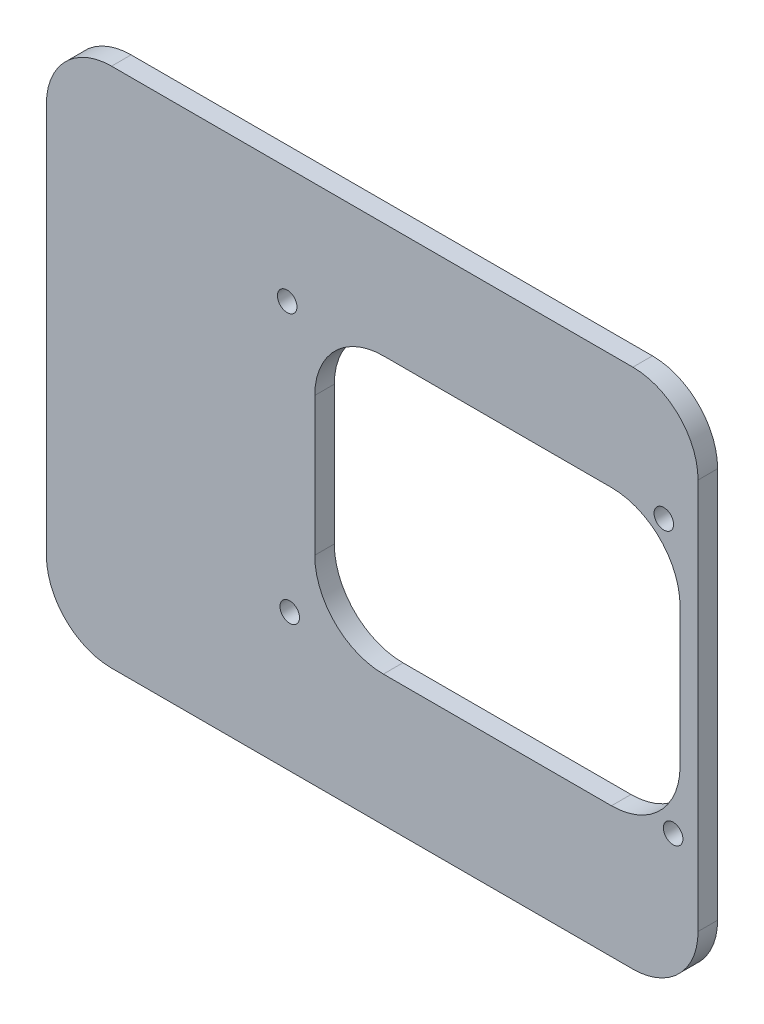
ISO-10303-21;
HEADER;
FILE_DESCRIPTION(('STEP AP214'),'2;1');
FILE_NAME('part.step','',(''),(''),'','','');
FILE_SCHEMA(('AUTOMOTIVE_DESIGN { 1 0 10303 214 1 1 1 1 }'));
ENDSEC;
DATA;
#1=APPLICATION_CONTEXT('core data for automotive mechanical design processes');
#2=APPLICATION_PROTOCOL_DEFINITION('international standard','automotive_design',2000,#1);
#3=PRODUCT_CONTEXT('',#1,'mechanical');
#4=PRODUCT('Part','Part','',(#3));
#5=PRODUCT_RELATED_PRODUCT_CATEGORY('part','',(#4));
#6=PRODUCT_DEFINITION_FORMATION('','',#4);
#7=PRODUCT_DEFINITION_CONTEXT('part definition',#1,'design');
#8=PRODUCT_DEFINITION('design','',#6,#7);
#9=PRODUCT_DEFINITION_SHAPE('','',#8);
#10=(LENGTH_UNIT() NAMED_UNIT(*) SI_UNIT(.MILLI.,.METRE.));
#11=(NAMED_UNIT(*) PLANE_ANGLE_UNIT() SI_UNIT($,.RADIAN.));
#12=(NAMED_UNIT(*) SI_UNIT($,.STERADIAN.) SOLID_ANGLE_UNIT());
#13=UNCERTAINTY_MEASURE_WITH_UNIT(LENGTH_MEASURE(1.E-05),#10,'distance_accuracy_value','');
#14=(GEOMETRIC_REPRESENTATION_CONTEXT(3) GLOBAL_UNCERTAINTY_ASSIGNED_CONTEXT((#13)) GLOBAL_UNIT_ASSIGNED_CONTEXT((#10,
#11,#12)) REPRESENTATION_CONTEXT('',''));
#15=CARTESIAN_POINT('',(0.,0.,0.));
#16=DIRECTION('',(0.,0.,1.));
#17=DIRECTION('',(1.,0.,0.));
#18=AXIS2_PLACEMENT_3D('',#15,#16,#17);
#19=CARTESIAN_POINT('',(7.122051999723,-1.872741623103,3.));
#20=DIRECTION('',(0.,0.,1.));
#21=DIRECTION('',(1.,0.,0.));
#22=AXIS2_PLACEMENT_3D('',#19,#20,#21);
#23=PLANE('',#22);
#24=CARTESIAN_POINT('',(-13.046573,19.865738,3.));
#25=DIRECTION('',(0.,0.,1.));
#26=DIRECTION('',(1.,0.,0.));
#27=AXIS2_PLACEMENT_3D('',#24,#25,#26);
#28=CIRCLE('',#27,1.5);
#29=CARTESIAN_POINT('',(-11.546573,19.865738,3.));
#30=VERTEX_POINT('',#29);
#31=EDGE_CURVE('E24',#30,#30,#28,.T.);
#32=ORIENTED_EDGE('',*,*,#31,.F.);
#33=EDGE_LOOP('',(#32));
#34=FACE_BOUND('',#33,.T.);
#35=CARTESIAN_POINT('',(44.745636,19.865738,3.));
#36=DIRECTION('',(0.,0.,1.));
#37=DIRECTION('',(1.,0.,0.));
#38=AXIS2_PLACEMENT_3D('',#35,#36,#37);
#39=CIRCLE('',#38,1.5);
#40=CARTESIAN_POINT('',(46.245636,19.865738,3.));
#41=VERTEX_POINT('',#40);
#42=EDGE_CURVE('E265',#41,#41,#39,.T.);
#43=ORIENTED_EDGE('',*,*,#42,.F.);
#44=EDGE_LOOP('',(#43));
#45=FACE_BOUND('',#44,.T.);
#46=CARTESIAN_POINT('',(-12.656964,-21.23714197154,3.));
#47=DIRECTION('',(0.,0.,1.));
#48=DIRECTION('',(1.,0.,0.));
#49=AXIS2_PLACEMENT_3D('',#46,#47,#48);
#50=CIRCLE('',#49,1.5);
#51=CARTESIAN_POINT('',(-11.156964,-21.23714197154,3.));
#52=VERTEX_POINT('',#51);
#53=EDGE_CURVE('E151',#52,#52,#50,.T.);
#54=ORIENTED_EDGE('',*,*,#53,.F.);
#55=EDGE_LOOP('',(#54));
#56=FACE_BOUND('',#55,.T.);
#57=CARTESIAN_POINT('',(46.174213,-21.23714197154,3.));
#58=DIRECTION('',(0.,0.,1.));
#59=DIRECTION('',(1.,0.,0.));
#60=AXIS2_PLACEMENT_3D('',#57,#58,#59);
#61=CIRCLE('',#60,1.5);
#62=CARTESIAN_POINT('',(47.674213,-21.23714197154,3.));
#63=VERTEX_POINT('',#62);
#64=EDGE_CURVE('E302',#63,#63,#61,.T.);
#65=ORIENTED_EDGE('',*,*,#64,.F.);
#66=EDGE_LOOP('',(#65));
#67=FACE_BOUND('',#66,.T.);
#68=DIRECTION('',(1.,0.,0.));
#69=VECTOR('',#68,1.);
#70=CARTESIAN_POINT('',(1.711141866892,20.,3.));
#71=LINE('',#70,#69);
#72=CARTESIAN_POINT('',(1.711141866892,20.,3.));
#73=VERTEX_POINT('',#72);
#74=CARTESIAN_POINT('',(36.711141866892,20.,3.));
#75=VERTEX_POINT('',#74);
#76=EDGE_CURVE('E361',#73,#75,#71,.T.);
#77=ORIENTED_EDGE('',*,*,#76,.T.);
#78=CARTESIAN_POINT('',(36.711141866892,9.471174926658,3.));
#79=DIRECTION('',(0.,0.,1.));
#80=DIRECTION('',(1.,0.,0.));
#81=AXIS2_PLACEMENT_3D('',#78,#79,#80);
#82=CIRCLE('',#81,10.528825073342);
#83=CARTESIAN_POINT('',(47.239966940235,9.471174926658,3.));
#84=VERTEX_POINT('',#83);
#85=EDGE_CURVE('E253',#84,#75,#82,.T.);
#86=ORIENTED_EDGE('',*,*,#85,.F.);
#87=DIRECTION('',(0.,-1.,0.));
#88=VECTOR('',#87,1.);
#89=CARTESIAN_POINT('',(47.239966940235,9.471174926658,3.));
#90=LINE('',#89,#88);
#91=CARTESIAN_POINT('',(47.239966940235,-11.76385872061,3.));
#92=VERTEX_POINT('',#91);
#93=EDGE_CURVE('E277',#84,#92,#90,.T.);
#94=ORIENTED_EDGE('',*,*,#93,.T.);
#95=CARTESIAN_POINT('',(36.711141866892,-11.76385872061,3.));
#96=DIRECTION('',(0.,0.,1.));
#97=DIRECTION('',(1.,0.,0.));
#98=AXIS2_PLACEMENT_3D('',#95,#96,#97);
#99=CIRCLE('',#98,10.528825073342);
#100=CARTESIAN_POINT('',(36.711141866892,-22.29268379395,3.));
#101=VERTEX_POINT('',#100);
#102=EDGE_CURVE('E248',#101,#92,#99,.T.);
#103=ORIENTED_EDGE('',*,*,#102,.F.);
#104=DIRECTION('',(-1.,0.,0.));
#105=VECTOR('',#104,1.);
#106=CARTESIAN_POINT('',(36.711141866892,-22.29268379395,3.));
#107=LINE('',#106,#105);
#108=CARTESIAN_POINT('',(1.711141866892,-22.29268379395,3.));
#109=VERTEX_POINT('',#108);
#110=EDGE_CURVE('E17',#101,#109,#107,.T.);
#111=ORIENTED_EDGE('',*,*,#110,.T.);
#112=CARTESIAN_POINT('',(1.711141866892,-11.76385872061,3.));
#113=DIRECTION('',(0.,0.,1.));
#114=DIRECTION('',(1.,0.,0.));
#115=AXIS2_PLACEMENT_3D('',#112,#113,#114);
#116=CIRCLE('',#115,10.528825073342);
#117=CARTESIAN_POINT('',(-8.81768320645,-11.76385872061,3.));
#118=VERTEX_POINT('',#117);
#119=EDGE_CURVE('E399',#118,#109,#116,.T.);
#120=ORIENTED_EDGE('',*,*,#119,.F.);
#121=DIRECTION('',(0.,1.,0.));
#122=VECTOR('',#121,1.);
#123=CARTESIAN_POINT('',(-8.81768320645,-11.76385872061,3.));
#124=LINE('',#123,#122);
#125=CARTESIAN_POINT('',(-8.81768320645,9.471174926658,3.));
#126=VERTEX_POINT('',#125);
#127=EDGE_CURVE('E218',#118,#126,#124,.T.);
#128=ORIENTED_EDGE('',*,*,#127,.T.);
#129=CARTESIAN_POINT('',(1.711141866892,9.471174926658,3.));
#130=DIRECTION('',(0.,0.,1.));
#131=DIRECTION('',(1.,0.,0.));
#132=AXIS2_PLACEMENT_3D('',#129,#130,#131);
#133=CIRCLE('',#132,10.528825073342);
#134=EDGE_CURVE('E230',#73,#126,#133,.T.);
#135=ORIENTED_EDGE('',*,*,#134,.F.);
#136=EDGE_LOOP('',(#77,#86,#94,#103,#111,#120,#128,#135));
#137=FACE_BOUND('',#136,.T.);
#138=CARTESIAN_POINT('',(-40.,27.641417965894,3.));
#139=DIRECTION('',(0.,0.,1.));
#140=DIRECTION('',(1.,0.,0.));
#141=AXIS2_PLACEMENT_3D('',#138,#139,#140);
#142=CIRCLE('',#141,9.999999999999);
#143=CARTESIAN_POINT('',(-40.,37.641417965894,3.));
#144=VERTEX_POINT('',#143);
#145=CARTESIAN_POINT('',(-50.,27.641417965894,3.));
#146=VERTEX_POINT('',#145);
#147=EDGE_CURVE('E259',#144,#146,#142,.T.);
#148=ORIENTED_EDGE('',*,*,#147,.T.);
#149=DIRECTION('',(0.,1.,0.));
#150=VECTOR('',#149,1.);
#151=CARTESIAN_POINT('',(-50.,-32.3585820341,3.));
#152=LINE('',#151,#150);
#153=CARTESIAN_POINT('',(-50.,-32.3585820341,3.));
#154=VERTEX_POINT('',#153);
#155=EDGE_CURVE('E351',#154,#146,#152,.T.);
#156=ORIENTED_EDGE('',*,*,#155,.F.);
#157=CARTESIAN_POINT('',(-40.,-32.3585820341,3.));
#158=DIRECTION('',(0.,0.,1.));
#159=DIRECTION('',(1.,0.,0.));
#160=AXIS2_PLACEMENT_3D('',#157,#158,#159);
#161=CIRCLE('',#160,9.999999999999);
#162=CARTESIAN_POINT('',(-40.,-42.3585820341,3.));
#163=VERTEX_POINT('',#162);
#164=EDGE_CURVE('E340',#154,#163,#161,.T.);
#165=ORIENTED_EDGE('',*,*,#164,.T.);
#166=DIRECTION('',(-1.,0.,0.));
#167=VECTOR('',#166,1.);
#168=CARTESIAN_POINT('',(40.,-42.3585820341,3.));
#169=LINE('',#168,#167);
#170=CARTESIAN_POINT('',(40.,-42.3585820341,3.));
#171=VERTEX_POINT('',#170);
#172=EDGE_CURVE('E373',#171,#163,#169,.T.);
#173=ORIENTED_EDGE('',*,*,#172,.F.);
#174=CARTESIAN_POINT('',(40.,-32.3585820341,3.));
#175=DIRECTION('',(0.,0.,1.));
#176=DIRECTION('',(1.,0.,0.));
#177=AXIS2_PLACEMENT_3D('',#174,#175,#176);
#178=CIRCLE('',#177,9.999999999999);
#179=CARTESIAN_POINT('',(49.999999999999,-32.3585820341,3.));
#180=VERTEX_POINT('',#179);
#181=EDGE_CURVE('E290',#171,#180,#178,.T.);
#182=ORIENTED_EDGE('',*,*,#181,.T.);
#183=DIRECTION('',(0.,-1.,0.));
#184=VECTOR('',#183,1.);
#185=CARTESIAN_POINT('',(49.999999999999,27.641417965895,3.));
#186=LINE('',#185,#184);
#187=CARTESIAN_POINT('',(49.999999999999,27.641417965895,3.));
#188=VERTEX_POINT('',#187);
#189=EDGE_CURVE('E289',#188,#180,#186,.T.);
#190=ORIENTED_EDGE('',*,*,#189,.F.);
#191=CARTESIAN_POINT('',(40.,27.641417965895,3.));
#192=DIRECTION('',(0.,0.,1.));
#193=DIRECTION('',(1.,0.,0.));
#194=AXIS2_PLACEMENT_3D('',#191,#192,#193);
#195=CIRCLE('',#194,9.999999999999);
#196=CARTESIAN_POINT('',(40.,37.641417965894,3.));
#197=VERTEX_POINT('',#196);
#198=EDGE_CURVE('E307',#188,#197,#195,.T.);
#199=ORIENTED_EDGE('',*,*,#198,.T.);
#200=DIRECTION('',(1.,0.,0.));
#201=VECTOR('',#200,1.);
#202=CARTESIAN_POINT('',(-40.,37.641417965894,3.));
#203=LINE('',#202,#201);
#204=EDGE_CURVE('E243',#144,#197,#203,.T.);
#205=ORIENTED_EDGE('',*,*,#204,.F.);
#206=EDGE_LOOP('',(#148,#156,#165,#173,#182,#190,#199,#205));
#207=FACE_BOUND('',#206,.T.);
#208=ADVANCED_FACE('F14',(#34,#45,#56,#67,#137,#207),#23,.T.);
#209=CARTESIAN_POINT('',(7.122051999723,-1.872741623103,0.));
#210=DIRECTION('',(0.,0.,1.));
#211=DIRECTION('',(1.,0.,0.));
#212=AXIS2_PLACEMENT_3D('',#209,#210,#211);
#213=PLANE('',#212);
#214=CARTESIAN_POINT('',(-13.046573,19.865738,0.));
#215=DIRECTION('',(0.,0.,1.));
#216=DIRECTION('',(1.,0.,0.));
#217=AXIS2_PLACEMENT_3D('',#214,#215,#216);
#218=CIRCLE('',#217,1.5);
#219=CARTESIAN_POINT('',(-11.546573,19.865738,0.));
#220=VERTEX_POINT('',#219);
#221=EDGE_CURVE('E9',#220,#220,#218,.T.);
#222=ORIENTED_EDGE('',*,*,#221,.T.);
#223=EDGE_LOOP('',(#222));
#224=FACE_BOUND('',#223,.T.);
#225=CARTESIAN_POINT('',(44.745636,19.865738,0.));
#226=DIRECTION('',(0.,0.,1.));
#227=DIRECTION('',(1.,0.,0.));
#228=AXIS2_PLACEMENT_3D('',#225,#226,#227);
#229=CIRCLE('',#228,1.5);
#230=CARTESIAN_POINT('',(46.245636,19.865738,0.));
#231=VERTEX_POINT('',#230);
#232=EDGE_CURVE('E160',#231,#231,#229,.T.);
#233=ORIENTED_EDGE('',*,*,#232,.T.);
#234=EDGE_LOOP('',(#233));
#235=FACE_BOUND('',#234,.T.);
#236=CARTESIAN_POINT('',(-12.656964,-21.23714197154,0.));
#237=DIRECTION('',(0.,0.,1.));
#238=DIRECTION('',(1.,0.,0.));
#239=AXIS2_PLACEMENT_3D('',#236,#237,#238);
#240=CIRCLE('',#239,1.5);
#241=CARTESIAN_POINT('',(-11.156964,-21.23714197154,0.));
#242=VERTEX_POINT('',#241);
#243=EDGE_CURVE('E142',#242,#242,#240,.T.);
#244=ORIENTED_EDGE('',*,*,#243,.T.);
#245=EDGE_LOOP('',(#244));
#246=FACE_BOUND('',#245,.T.);
#247=CARTESIAN_POINT('',(46.174213,-21.23714197154,0.));
#248=DIRECTION('',(0.,0.,1.));
#249=DIRECTION('',(1.,0.,0.));
#250=AXIS2_PLACEMENT_3D('',#247,#248,#249);
#251=CIRCLE('',#250,1.5);
#252=CARTESIAN_POINT('',(47.674213,-21.23714197154,0.));
#253=VERTEX_POINT('',#252);
#254=EDGE_CURVE('E119',#253,#253,#251,.T.);
#255=ORIENTED_EDGE('',*,*,#254,.T.);
#256=EDGE_LOOP('',(#255));
#257=FACE_BOUND('',#256,.T.);
#258=CARTESIAN_POINT('',(1.711141866892,9.471174926658,0.));
#259=DIRECTION('',(0.,0.,1.));
#260=DIRECTION('',(1.,0.,0.));
#261=AXIS2_PLACEMENT_3D('',#258,#259,#260);
#262=CIRCLE('',#261,10.528825073342);
#263=CARTESIAN_POINT('',(1.711141866892,20.,0.));
#264=VERTEX_POINT('',#263);
#265=CARTESIAN_POINT('',(-8.81768320645,9.471174926658,0.));
#266=VERTEX_POINT('',#265);
#267=EDGE_CURVE('E219',#264,#266,#262,.T.);
#268=ORIENTED_EDGE('',*,*,#267,.T.);
#269=DIRECTION('',(0.,1.,0.));
#270=VECTOR('',#269,1.);
#271=CARTESIAN_POINT('',(-8.81768320645,-11.76385872061,0.));
#272=LINE('',#271,#270);
#273=CARTESIAN_POINT('',(-8.81768320645,-11.76385872061,0.));
#274=VERTEX_POINT('',#273);
#275=EDGE_CURVE('E206',#274,#266,#272,.T.);
#276=ORIENTED_EDGE('',*,*,#275,.F.);
#277=CARTESIAN_POINT('',(1.711141866892,-11.76385872061,0.));
#278=DIRECTION('',(0.,0.,1.));
#279=DIRECTION('',(1.,0.,0.));
#280=AXIS2_PLACEMENT_3D('',#277,#278,#279);
#281=CIRCLE('',#280,10.528825073342);
#282=CARTESIAN_POINT('',(1.711141866892,-22.29268379395,0.));
#283=VERTEX_POINT('',#282);
#284=EDGE_CURVE('E298',#274,#283,#281,.T.);
#285=ORIENTED_EDGE('',*,*,#284,.T.);
#286=DIRECTION('',(-1.,0.,0.));
#287=VECTOR('',#286,1.);
#288=CARTESIAN_POINT('',(36.711141866892,-22.29268379395,0.));
#289=LINE('',#288,#287);
#290=CARTESIAN_POINT('',(36.711141866892,-22.29268379395,0.));
#291=VERTEX_POINT('',#290);
#292=EDGE_CURVE('E295',#291,#283,#289,.T.);
#293=ORIENTED_EDGE('',*,*,#292,.F.);
#294=CARTESIAN_POINT('',(36.711141866892,-11.76385872061,0.));
#295=DIRECTION('',(0.,0.,1.));
#296=DIRECTION('',(1.,0.,0.));
#297=AXIS2_PLACEMENT_3D('',#294,#295,#296);
#298=CIRCLE('',#297,10.528825073342);
#299=CARTESIAN_POINT('',(47.239966940235,-11.76385872061,0.));
#300=VERTEX_POINT('',#299);
#301=EDGE_CURVE('E278',#291,#300,#298,.T.);
#302=ORIENTED_EDGE('',*,*,#301,.T.);
#303=DIRECTION('',(0.,-1.,0.));
#304=VECTOR('',#303,1.);
#305=CARTESIAN_POINT('',(47.239966940235,9.471174926658,0.));
#306=LINE('',#305,#304);
#307=CARTESIAN_POINT('',(47.239966940235,9.471174926658,0.));
#308=VERTEX_POINT('',#307);
#309=EDGE_CURVE('E274',#308,#300,#306,.T.);
#310=ORIENTED_EDGE('',*,*,#309,.F.);
#311=CARTESIAN_POINT('',(36.711141866892,9.471174926658,0.));
#312=DIRECTION('',(0.,0.,1.));
#313=DIRECTION('',(1.,0.,0.));
#314=AXIS2_PLACEMENT_3D('',#311,#312,#313);
#315=CIRCLE('',#314,10.528825073342);
#316=CARTESIAN_POINT('',(36.711141866892,20.,0.));
#317=VERTEX_POINT('',#316);
#318=EDGE_CURVE('E252',#308,#317,#315,.T.);
#319=ORIENTED_EDGE('',*,*,#318,.T.);
#320=DIRECTION('',(1.,0.,0.));
#321=VECTOR('',#320,1.);
#322=CARTESIAN_POINT('',(1.711141866892,20.,0.));
#323=LINE('',#322,#321);
#324=EDGE_CURVE('E133',#264,#317,#323,.T.);
#325=ORIENTED_EDGE('',*,*,#324,.F.);
#326=EDGE_LOOP('',(#268,#276,#285,#293,#302,#310,#319,#325));
#327=FACE_BOUND('',#326,.T.);
#328=DIRECTION('',(1.,0.,0.));
#329=VECTOR('',#328,1.);
#330=CARTESIAN_POINT('',(-40.,37.641417965894,0.));
#331=LINE('',#330,#329);
#332=CARTESIAN_POINT('',(-40.,37.641417965894,0.));
#333=VERTEX_POINT('',#332);
#334=CARTESIAN_POINT('',(40.,37.641417965894,0.));
#335=VERTEX_POINT('',#334);
#336=EDGE_CURVE('E240',#333,#335,#331,.T.);
#337=ORIENTED_EDGE('',*,*,#336,.T.);
#338=CARTESIAN_POINT('',(40.,27.641417965895,0.));
#339=DIRECTION('',(0.,0.,1.));
#340=DIRECTION('',(1.,0.,0.));
#341=AXIS2_PLACEMENT_3D('',#338,#339,#340);
#342=CIRCLE('',#341,9.999999999999);
#343=CARTESIAN_POINT('',(49.999999999999,27.641417965895,0.));
#344=VERTEX_POINT('',#343);
#345=EDGE_CURVE('E308',#344,#335,#342,.T.);
#346=ORIENTED_EDGE('',*,*,#345,.F.);
#347=DIRECTION('',(0.,-1.,0.));
#348=VECTOR('',#347,1.);
#349=CARTESIAN_POINT('',(49.999999999999,27.641417965895,0.));
#350=LINE('',#349,#348);
#351=CARTESIAN_POINT('',(49.999999999999,-32.3585820341,0.));
#352=VERTEX_POINT('',#351);
#353=EDGE_CURVE('E332',#344,#352,#350,.T.);
#354=ORIENTED_EDGE('',*,*,#353,.T.);
#355=CARTESIAN_POINT('',(40.,-32.3585820341,0.));
#356=DIRECTION('',(0.,0.,1.));
#357=DIRECTION('',(1.,0.,0.));
#358=AXIS2_PLACEMENT_3D('',#355,#356,#357);
#359=CIRCLE('',#358,9.999999999999);
#360=CARTESIAN_POINT('',(40.,-42.3585820341,0.));
#361=VERTEX_POINT('',#360);
#362=EDGE_CURVE('E268',#361,#352,#359,.T.);
#363=ORIENTED_EDGE('',*,*,#362,.F.);
#364=DIRECTION('',(-1.,0.,0.));
#365=VECTOR('',#364,1.);
#366=CARTESIAN_POINT('',(40.,-42.3585820341,0.));
#367=LINE('',#366,#365);
#368=CARTESIAN_POINT('',(-40.,-42.3585820341,0.));
#369=VERTEX_POINT('',#368);
#370=EDGE_CURVE('E273',#361,#369,#367,.T.);
#371=ORIENTED_EDGE('',*,*,#370,.T.);
#372=CARTESIAN_POINT('',(-40.,-32.3585820341,0.));
#373=DIRECTION('',(0.,0.,1.));
#374=DIRECTION('',(1.,0.,0.));
#375=AXIS2_PLACEMENT_3D('',#372,#373,#374);
#376=CIRCLE('',#375,9.999999999999);
#377=CARTESIAN_POINT('',(-50.,-32.3585820341,0.));
#378=VERTEX_POINT('',#377);
#379=EDGE_CURVE('E279',#378,#369,#376,.T.);
#380=ORIENTED_EDGE('',*,*,#379,.F.);
#381=DIRECTION('',(0.,1.,0.));
#382=VECTOR('',#381,1.);
#383=CARTESIAN_POINT('',(-50.,-32.3585820341,0.));
#384=LINE('',#383,#382);
#385=CARTESIAN_POINT('',(-50.,27.641417965894,0.));
#386=VERTEX_POINT('',#385);
#387=EDGE_CURVE('E284',#378,#386,#384,.T.);
#388=ORIENTED_EDGE('',*,*,#387,.T.);
#389=CARTESIAN_POINT('',(-40.,27.641417965894,0.));
#390=DIRECTION('',(0.,0.,1.));
#391=DIRECTION('',(1.,0.,0.));
#392=AXIS2_PLACEMENT_3D('',#389,#390,#391);
#393=CIRCLE('',#392,9.999999999999);
#394=EDGE_CURVE('E335',#333,#386,#393,.T.);
#395=ORIENTED_EDGE('',*,*,#394,.F.);
#396=EDGE_LOOP('',(#337,#346,#354,#363,#371,#380,#388,#395));
#397=FACE_BOUND('',#396,.T.);
#398=ADVANCED_FACE('F222',(#224,#235,#246,#257,#327,#397),#213,.F.);
#399=CARTESIAN_POINT('',(-13.046573,19.865738,0.));
#400=DIRECTION('',(0.,0.,-1.));
#401=DIRECTION('',(1.,0.,0.));
#402=AXIS2_PLACEMENT_3D('',#399,#400,#401);
#403=CYLINDRICAL_SURFACE('',#402,1.5);
#404=DIRECTION('',(0.,0.,1.));
#405=VECTOR('',#404,1.);
#406=CARTESIAN_POINT('',(-11.546573,19.865738,0.));
#407=LINE('',#406,#405);
#408=EDGE_CURVE('E260',#220,#30,#407,.T.);
#409=ORIENTED_EDGE('',*,*,#408,.T.);
#410=ORIENTED_EDGE('',*,*,#31,.T.);
#411=ORIENTED_EDGE('',*,*,#408,.F.);
#412=ORIENTED_EDGE('',*,*,#221,.F.);
#413=EDGE_LOOP('',(#409,#410,#411,#412));
#414=FACE_BOUND('',#413,.T.);
#415=ADVANCED_FACE('F489',(#414),#403,.F.);
#416=CARTESIAN_POINT('',(44.745636,19.865738,0.));
#417=DIRECTION('',(0.,0.,-1.));
#418=DIRECTION('',(1.,0.,0.));
#419=AXIS2_PLACEMENT_3D('',#416,#417,#418);
#420=CYLINDRICAL_SURFACE('',#419,1.5);
#421=DIRECTION('',(0.,0.,1.));
#422=VECTOR('',#421,1.);
#423=CARTESIAN_POINT('',(46.245636,19.865738,0.));
#424=LINE('',#423,#422);
#425=EDGE_CURVE('E329',#231,#41,#424,.T.);
#426=ORIENTED_EDGE('',*,*,#425,.T.);
#427=ORIENTED_EDGE('',*,*,#42,.T.);
#428=ORIENTED_EDGE('',*,*,#425,.F.);
#429=ORIENTED_EDGE('',*,*,#232,.F.);
#430=EDGE_LOOP('',(#426,#427,#428,#429));
#431=FACE_BOUND('',#430,.T.);
#432=ADVANCED_FACE('F509',(#431),#420,.F.);
#433=CARTESIAN_POINT('',(-12.656964,-21.23714197154,0.));
#434=DIRECTION('',(0.,0.,-1.));
#435=DIRECTION('',(1.,0.,0.));
#436=AXIS2_PLACEMENT_3D('',#433,#434,#435);
#437=CYLINDRICAL_SURFACE('',#436,1.5);
#438=DIRECTION('',(0.,0.,1.));
#439=VECTOR('',#438,1.);
#440=CARTESIAN_POINT('',(-11.156964,-21.23714197154,0.));
#441=LINE('',#440,#439);
#442=EDGE_CURVE('E301',#242,#52,#441,.T.);
#443=ORIENTED_EDGE('',*,*,#442,.T.);
#444=ORIENTED_EDGE('',*,*,#53,.T.);
#445=ORIENTED_EDGE('',*,*,#442,.F.);
#446=ORIENTED_EDGE('',*,*,#243,.F.);
#447=EDGE_LOOP('',(#443,#444,#445,#446));
#448=FACE_BOUND('',#447,.T.);
#449=ADVANCED_FACE('F502',(#448),#437,.F.);
#450=CARTESIAN_POINT('',(46.174213,-21.23714197154,0.));
#451=DIRECTION('',(0.,0.,-1.));
#452=DIRECTION('',(1.,0.,0.));
#453=AXIS2_PLACEMENT_3D('',#450,#451,#452);
#454=CYLINDRICAL_SURFACE('',#453,1.5);
#455=DIRECTION('',(0.,0.,1.));
#456=VECTOR('',#455,1.);
#457=CARTESIAN_POINT('',(47.674213,-21.23714197154,0.));
#458=LINE('',#457,#456);
#459=EDGE_CURVE('E364',#253,#63,#458,.T.);
#460=ORIENTED_EDGE('',*,*,#459,.T.);
#461=ORIENTED_EDGE('',*,*,#64,.T.);
#462=ORIENTED_EDGE('',*,*,#459,.F.);
#463=ORIENTED_EDGE('',*,*,#254,.F.);
#464=EDGE_LOOP('',(#460,#461,#462,#463));
#465=FACE_BOUND('',#464,.T.);
#466=ADVANCED_FACE('F499',(#465),#454,.F.);
#467=CARTESIAN_POINT('',(1.711141866892,20.,0.));
#468=DIRECTION('',(0.,1.,0.));
#469=DIRECTION('',(1.,0.,0.));
#470=AXIS2_PLACEMENT_3D('',#467,#468,#469);
#471=PLANE('',#470);
#472=ORIENTED_EDGE('',*,*,#324,.T.);
#473=DIRECTION('',(0.,0.,1.));
#474=VECTOR('',#473,1.);
#475=CARTESIAN_POINT('',(36.711141866892,20.,0.));
#476=LINE('',#475,#474);
#477=EDGE_CURVE('E249',#317,#75,#476,.T.);
#478=ORIENTED_EDGE('',*,*,#477,.T.);
#479=ORIENTED_EDGE('',*,*,#76,.F.);
#480=DIRECTION('',(0.,0.,1.));
#481=VECTOR('',#480,1.);
#482=CARTESIAN_POINT('',(1.711141866892,20.,0.));
#483=LINE('',#482,#481);
#484=EDGE_CURVE('E237',#264,#73,#483,.T.);
#485=ORIENTED_EDGE('',*,*,#484,.F.);
#486=EDGE_LOOP('',(#472,#478,#479,#485));
#487=FACE_BOUND('',#486,.T.);
#488=ADVANCED_FACE('F501',(#487),#471,.F.);
#489=CARTESIAN_POINT('',(36.711141866892,9.471174926658,0.));
#490=DIRECTION('',(0.,0.,-1.));
#491=DIRECTION('',(1.,0.,0.));
#492=AXIS2_PLACEMENT_3D('',#489,#490,#491);
#493=CYLINDRICAL_SURFACE('',#492,10.528825073342);
#494=DIRECTION('',(0.,0.,1.));
#495=VECTOR('',#494,1.);
#496=CARTESIAN_POINT('',(47.239966940235,9.471174926658,0.));
#497=LINE('',#496,#495);
#498=EDGE_CURVE('E294',#308,#84,#497,.T.);
#499=ORIENTED_EDGE('',*,*,#498,.T.);
#500=ORIENTED_EDGE('',*,*,#85,.T.);
#501=ORIENTED_EDGE('',*,*,#477,.F.);
#502=ORIENTED_EDGE('',*,*,#318,.F.);
#503=EDGE_LOOP('',(#499,#500,#501,#502));
#504=FACE_BOUND('',#503,.T.);
#505=ADVANCED_FACE('F507',(#504),#493,.F.);
#506=CARTESIAN_POINT('',(47.239966940235,9.471174926658,0.));
#507=DIRECTION('',(1.,0.,0.));
#508=DIRECTION('',(0.,1.,0.));
#509=AXIS2_PLACEMENT_3D('',#506,#507,#508);
#510=PLANE('',#509);
#511=ORIENTED_EDGE('',*,*,#309,.T.);
#512=DIRECTION('',(0.,0.,1.));
#513=VECTOR('',#512,1.);
#514=CARTESIAN_POINT('',(47.239966940235,-11.76385872061,0.));
#515=LINE('',#514,#513);
#516=EDGE_CURVE('E318',#300,#92,#515,.T.);
#517=ORIENTED_EDGE('',*,*,#516,.T.);
#518=ORIENTED_EDGE('',*,*,#93,.F.);
#519=ORIENTED_EDGE('',*,*,#498,.F.);
#520=EDGE_LOOP('',(#511,#517,#518,#519));
#521=FACE_BOUND('',#520,.T.);
#522=ADVANCED_FACE('F540',(#521),#510,.F.);
#523=CARTESIAN_POINT('',(36.711141866892,-11.76385872061,0.));
#524=DIRECTION('',(0.,0.,-1.));
#525=DIRECTION('',(1.,0.,0.));
#526=AXIS2_PLACEMENT_3D('',#523,#524,#525);
#527=CYLINDRICAL_SURFACE('',#526,10.528825073342);
#528=DIRECTION('',(0.,0.,1.));
#529=VECTOR('',#528,1.);
#530=CARTESIAN_POINT('',(36.711141866892,-22.29268379395,0.));
#531=LINE('',#530,#529);
#532=EDGE_CURVE('E244',#291,#101,#531,.T.);
#533=ORIENTED_EDGE('',*,*,#532,.T.);
#534=ORIENTED_EDGE('',*,*,#102,.T.);
#535=ORIENTED_EDGE('',*,*,#516,.F.);
#536=ORIENTED_EDGE('',*,*,#301,.F.);
#537=EDGE_LOOP('',(#533,#534,#535,#536));
#538=FACE_BOUND('',#537,.T.);
#539=ADVANCED_FACE('F516',(#538),#527,.F.);
#540=CARTESIAN_POINT('',(36.711141866892,-22.29268379395,0.));
#541=DIRECTION('',(0.,-1.,0.));
#542=DIRECTION('',(0.,0.,-1.));
#543=AXIS2_PLACEMENT_3D('',#540,#541,#542);
#544=PLANE('',#543);
#545=ORIENTED_EDGE('',*,*,#292,.T.);
#546=DIRECTION('',(0.,0.,1.));
#547=VECTOR('',#546,1.);
#548=CARTESIAN_POINT('',(1.711141866892,-22.29268379395,0.));
#549=LINE('',#548,#547);
#550=EDGE_CURVE('E325',#283,#109,#549,.T.);
#551=ORIENTED_EDGE('',*,*,#550,.T.);
#552=ORIENTED_EDGE('',*,*,#110,.F.);
#553=ORIENTED_EDGE('',*,*,#532,.F.);
#554=EDGE_LOOP('',(#545,#551,#552,#553));
#555=FACE_BOUND('',#554,.T.);
#556=ADVANCED_FACE('F435',(#555),#544,.F.);
#557=CARTESIAN_POINT('',(1.711141866892,-11.76385872061,0.));
#558=DIRECTION('',(0.,0.,-1.));
#559=DIRECTION('',(1.,0.,0.));
#560=AXIS2_PLACEMENT_3D('',#557,#558,#559);
#561=CYLINDRICAL_SURFACE('',#560,10.528825073342);
#562=DIRECTION('',(0.,0.,1.));
#563=VECTOR('',#562,1.);
#564=CARTESIAN_POINT('',(-8.81768320645,-11.76385872061,0.));
#565=LINE('',#564,#563);
#566=EDGE_CURVE('E214',#274,#118,#565,.T.);
#567=ORIENTED_EDGE('',*,*,#566,.T.);
#568=ORIENTED_EDGE('',*,*,#119,.T.);
#569=ORIENTED_EDGE('',*,*,#550,.F.);
#570=ORIENTED_EDGE('',*,*,#284,.F.);
#571=EDGE_LOOP('',(#567,#568,#569,#570));
#572=FACE_BOUND('',#571,.T.);
#573=ADVANCED_FACE('F425',(#572),#561,.F.);
#574=CARTESIAN_POINT('',(-8.81768320645,-11.76385872061,0.));
#575=DIRECTION('',(-1.,0.,0.));
#576=DIRECTION('',(0.,0.,1.));
#577=AXIS2_PLACEMENT_3D('',#574,#575,#576);
#578=PLANE('',#577);
#579=ORIENTED_EDGE('',*,*,#275,.T.);
#580=DIRECTION('',(0.,0.,1.));
#581=VECTOR('',#580,1.);
#582=CARTESIAN_POINT('',(-8.81768320645,9.471174926658,0.));
#583=LINE('',#582,#581);
#584=EDGE_CURVE('E211',#266,#126,#583,.T.);
#585=ORIENTED_EDGE('',*,*,#584,.T.);
#586=ORIENTED_EDGE('',*,*,#127,.F.);
#587=ORIENTED_EDGE('',*,*,#566,.F.);
#588=EDGE_LOOP('',(#579,#585,#586,#587));
#589=FACE_BOUND('',#588,.T.);
#590=ADVANCED_FACE('F208',(#589),#578,.F.);
#591=CARTESIAN_POINT('',(1.711141866892,9.471174926658,0.));
#592=DIRECTION('',(0.,0.,-1.));
#593=DIRECTION('',(1.,0.,0.));
#594=AXIS2_PLACEMENT_3D('',#591,#592,#593);
#595=CYLINDRICAL_SURFACE('',#594,10.528825073342);
#596=ORIENTED_EDGE('',*,*,#484,.T.);
#597=ORIENTED_EDGE('',*,*,#134,.T.);
#598=ORIENTED_EDGE('',*,*,#584,.F.);
#599=ORIENTED_EDGE('',*,*,#267,.F.);
#600=EDGE_LOOP('',(#596,#597,#598,#599));
#601=FACE_BOUND('',#600,.T.);
#602=ADVANCED_FACE('F228',(#601),#595,.F.);
#603=CARTESIAN_POINT('',(-40.,37.641417965894,0.));
#604=DIRECTION('',(0.,1.,0.));
#605=DIRECTION('',(1.,0.,0.));
#606=AXIS2_PLACEMENT_3D('',#603,#604,#605);
#607=PLANE('',#606);
#608=DIRECTION('',(0.,0.,1.));
#609=VECTOR('',#608,1.);
#610=CARTESIAN_POINT('',(-40.,37.641417965894,0.));
#611=LINE('',#610,#609);
#612=EDGE_CURVE('E254',#333,#144,#611,.T.);
#613=ORIENTED_EDGE('',*,*,#612,.T.);
#614=ORIENTED_EDGE('',*,*,#204,.T.);
#615=DIRECTION('',(0.,0.,1.));
#616=VECTOR('',#615,1.);
#617=CARTESIAN_POINT('',(40.,37.641417965894,0.));
#618=LINE('',#617,#616);
#619=EDGE_CURVE('E303',#335,#197,#618,.T.);
#620=ORIENTED_EDGE('',*,*,#619,.F.);
#621=ORIENTED_EDGE('',*,*,#336,.F.);
#622=EDGE_LOOP('',(#613,#614,#620,#621));
#623=FACE_BOUND('',#622,.T.);
#624=ADVANCED_FACE('F469',(#623),#607,.T.);
#625=CARTESIAN_POINT('',(40.,27.641417965895,0.));
#626=DIRECTION('',(0.,0.,-1.));
#627=DIRECTION('',(1.,0.,0.));
#628=AXIS2_PLACEMENT_3D('',#625,#626,#627);
#629=CYLINDRICAL_SURFACE('',#628,9.999999999999);
#630=ORIENTED_EDGE('',*,*,#345,.T.);
#631=ORIENTED_EDGE('',*,*,#619,.T.);
#632=ORIENTED_EDGE('',*,*,#198,.F.);
#633=DIRECTION('',(0.,0.,1.));
#634=VECTOR('',#633,1.);
#635=CARTESIAN_POINT('',(49.999999999999,27.641417965895,0.));
#636=LINE('',#635,#634);
#637=EDGE_CURVE('E285',#344,#188,#636,.T.);
#638=ORIENTED_EDGE('',*,*,#637,.F.);
#639=EDGE_LOOP('',(#630,#631,#632,#638));
#640=FACE_BOUND('',#639,.T.);
#641=ADVANCED_FACE('F473',(#640),#629,.T.);
#642=CARTESIAN_POINT('',(49.999999999999,27.641417965895,0.));
#643=DIRECTION('',(1.,0.,0.));
#644=DIRECTION('',(0.,1.,0.));
#645=AXIS2_PLACEMENT_3D('',#642,#643,#644);
#646=PLANE('',#645);
#647=ORIENTED_EDGE('',*,*,#637,.T.);
#648=ORIENTED_EDGE('',*,*,#189,.T.);
#649=DIRECTION('',(0.,0.,1.));
#650=VECTOR('',#649,1.);
#651=CARTESIAN_POINT('',(49.999999999999,-32.3585820341,0.));
#652=LINE('',#651,#650);
#653=EDGE_CURVE('E272',#352,#180,#652,.T.);
#654=ORIENTED_EDGE('',*,*,#653,.F.);
#655=ORIENTED_EDGE('',*,*,#353,.F.);
#656=EDGE_LOOP('',(#647,#648,#654,#655));
#657=FACE_BOUND('',#656,.T.);
#658=ADVANCED_FACE('F477',(#657),#646,.T.);
#659=CARTESIAN_POINT('',(40.,-32.3585820341,0.));
#660=DIRECTION('',(0.,0.,-1.));
#661=DIRECTION('',(1.,0.,0.));
#662=AXIS2_PLACEMENT_3D('',#659,#660,#661);
#663=CYLINDRICAL_SURFACE('',#662,9.999999999999);
#664=ORIENTED_EDGE('',*,*,#362,.T.);
#665=ORIENTED_EDGE('',*,*,#653,.T.);
#666=ORIENTED_EDGE('',*,*,#181,.F.);
#667=DIRECTION('',(0.,0.,1.));
#668=VECTOR('',#667,1.);
#669=CARTESIAN_POINT('',(40.,-42.3585820341,0.));
#670=LINE('',#669,#668);
#671=EDGE_CURVE('E344',#361,#171,#670,.T.);
#672=ORIENTED_EDGE('',*,*,#671,.F.);
#673=EDGE_LOOP('',(#664,#665,#666,#672));
#674=FACE_BOUND('',#673,.T.);
#675=ADVANCED_FACE('F480',(#674),#663,.T.);
#676=CARTESIAN_POINT('',(40.,-42.3585820341,0.));
#677=DIRECTION('',(0.,-1.,0.));
#678=DIRECTION('',(0.,0.,-1.));
#679=AXIS2_PLACEMENT_3D('',#676,#677,#678);
#680=PLANE('',#679);
#681=ORIENTED_EDGE('',*,*,#671,.T.);
#682=ORIENTED_EDGE('',*,*,#172,.T.);
#683=DIRECTION('',(0.,0.,1.));
#684=VECTOR('',#683,1.);
#685=CARTESIAN_POINT('',(-40.,-42.3585820341,0.));
#686=LINE('',#685,#684);
#687=EDGE_CURVE('E283',#369,#163,#686,.T.);
#688=ORIENTED_EDGE('',*,*,#687,.F.);
#689=ORIENTED_EDGE('',*,*,#370,.F.);
#690=EDGE_LOOP('',(#681,#682,#688,#689));
#691=FACE_BOUND('',#690,.T.);
#692=ADVANCED_FACE('F453',(#691),#680,.T.);
#693=CARTESIAN_POINT('',(-40.,-32.3585820341,0.));
#694=DIRECTION('',(0.,0.,-1.));
#695=DIRECTION('',(1.,0.,0.));
#696=AXIS2_PLACEMENT_3D('',#693,#694,#695);
#697=CYLINDRICAL_SURFACE('',#696,9.999999999999);
#698=ORIENTED_EDGE('',*,*,#379,.T.);
#699=ORIENTED_EDGE('',*,*,#687,.T.);
#700=ORIENTED_EDGE('',*,*,#164,.F.);
#701=DIRECTION('',(0.,0.,1.));
#702=VECTOR('',#701,1.);
#703=CARTESIAN_POINT('',(-50.,-32.3585820341,0.));
#704=LINE('',#703,#702);
#705=EDGE_CURVE('E258',#378,#154,#704,.T.);
#706=ORIENTED_EDGE('',*,*,#705,.F.);
#707=EDGE_LOOP('',(#698,#699,#700,#706));
#708=FACE_BOUND('',#707,.T.);
#709=ADVANCED_FACE('F457',(#708),#697,.T.);
#710=CARTESIAN_POINT('',(-50.,-32.3585820341,0.));
#711=DIRECTION('',(-1.,0.,0.));
#712=DIRECTION('',(0.,0.,1.));
#713=AXIS2_PLACEMENT_3D('',#710,#711,#712);
#714=PLANE('',#713);
#715=ORIENTED_EDGE('',*,*,#705,.T.);
#716=ORIENTED_EDGE('',*,*,#155,.T.);
#717=DIRECTION('',(0.,0.,1.));
#718=VECTOR('',#717,1.);
#719=CARTESIAN_POINT('',(-50.,27.641417965894,0.));
#720=LINE('',#719,#718);
#721=EDGE_CURVE('E339',#386,#146,#720,.T.);
#722=ORIENTED_EDGE('',*,*,#721,.F.);
#723=ORIENTED_EDGE('',*,*,#387,.F.);
#724=EDGE_LOOP('',(#715,#716,#722,#723));
#725=FACE_BOUND('',#724,.T.);
#726=ADVANCED_FACE('F460',(#725),#714,.T.);
#727=CARTESIAN_POINT('',(-40.,27.641417965894,0.));
#728=DIRECTION('',(0.,0.,-1.));
#729=DIRECTION('',(1.,0.,0.));
#730=AXIS2_PLACEMENT_3D('',#727,#728,#729);
#731=CYLINDRICAL_SURFACE('',#730,9.999999999999);
#732=ORIENTED_EDGE('',*,*,#394,.T.);
#733=ORIENTED_EDGE('',*,*,#721,.T.);
#734=ORIENTED_EDGE('',*,*,#147,.F.);
#735=ORIENTED_EDGE('',*,*,#612,.F.);
#736=EDGE_LOOP('',(#732,#733,#734,#735));
#737=FACE_BOUND('',#736,.T.);
#738=ADVANCED_FACE('F466',(#737),#731,.T.);
#739=CLOSED_SHELL('',(#208,#398,#415,#432,#449,#466,#488,#505,#522,#539,#556,#573,#590,#602,
#624,#641,#658,#675,#692,#709,#726,#738));
#740=MANIFOLD_SOLID_BREP('B1',#739);
#741=ADVANCED_BREP_SHAPE_REPRESENTATION('',(#18,#740),#14);
#742=SHAPE_DEFINITION_REPRESENTATION(#9,#741);
ENDSEC;
END-ISO-10303-21;
